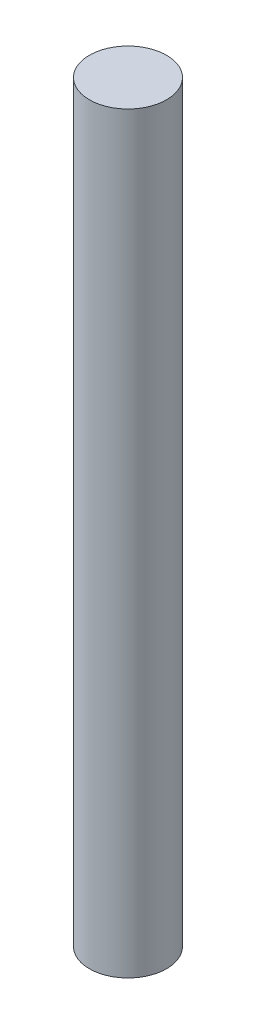
ISO-10303-21;
HEADER;
FILE_DESCRIPTION(('STEP AP214'),'2;1');
FILE_NAME('part.step','',(''),(''),'','','');
FILE_SCHEMA(('AUTOMOTIVE_DESIGN { 1 0 10303 214 1 1 1 1 }'));
ENDSEC;
DATA;
#1=APPLICATION_CONTEXT('core data for automotive mechanical design processes');
#2=APPLICATION_PROTOCOL_DEFINITION('international standard','automotive_design',2000,#1);
#3=PRODUCT_CONTEXT('',#1,'mechanical');
#4=PRODUCT('Part','Part','',(#3));
#5=PRODUCT_RELATED_PRODUCT_CATEGORY('part','',(#4));
#6=PRODUCT_DEFINITION_FORMATION('','',#4);
#7=PRODUCT_DEFINITION_CONTEXT('part definition',#1,'design');
#8=PRODUCT_DEFINITION('design','',#6,#7);
#9=PRODUCT_DEFINITION_SHAPE('','',#8);
#10=(LENGTH_UNIT() NAMED_UNIT(*) SI_UNIT(.MILLI.,.METRE.));
#11=(NAMED_UNIT(*) PLANE_ANGLE_UNIT() SI_UNIT($,.RADIAN.));
#12=(NAMED_UNIT(*) SI_UNIT($,.STERADIAN.) SOLID_ANGLE_UNIT());
#13=UNCERTAINTY_MEASURE_WITH_UNIT(LENGTH_MEASURE(1.E-05),#10,'distance_accuracy_value','');
#14=(GEOMETRIC_REPRESENTATION_CONTEXT(3) GLOBAL_UNCERTAINTY_ASSIGNED_CONTEXT((#13)) GLOBAL_UNIT_ASSIGNED_CONTEXT((#10,
#11,#12)) REPRESENTATION_CONTEXT('',''));
#15=CARTESIAN_POINT('',(0.,0.,0.));
#16=DIRECTION('',(0.,0.,1.));
#17=DIRECTION('',(1.,0.,0.));
#18=AXIS2_PLACEMENT_3D('',#15,#16,#17);
#19=CARTESIAN_POINT('',(0.,39.,0.));
#20=DIRECTION('',(0.,-1.,0.));
#21=DIRECTION('',(0.,0.,-1.));
#22=AXIS2_PLACEMENT_3D('',#19,#20,#21);
#23=CYLINDRICAL_SURFACE('',#22,2.);
#24=CARTESIAN_POINT('',(0.,39.,0.));
#25=DIRECTION('',(0.,1.,0.));
#26=DIRECTION('',(0.,0.,1.));
#27=AXIS2_PLACEMENT_3D('',#24,#25,#26);
#28=CIRCLE('',#27,2.);
#29=CARTESIAN_POINT('',(0.,39.,2.));
#30=VERTEX_POINT('',#29);
#31=EDGE_CURVE('E10',#30,#30,#28,.T.);
#32=ORIENTED_EDGE('',*,*,#31,.F.);
#33=EDGE_LOOP('',(#32));
#34=FACE_BOUND('',#33,.T.);
#35=CARTESIAN_POINT('',(0.,0.,0.));
#36=DIRECTION('',(0.,1.,0.));
#37=DIRECTION('',(0.,0.,1.));
#38=AXIS2_PLACEMENT_3D('',#35,#36,#37);
#39=CIRCLE('',#38,2.);
#40=CARTESIAN_POINT('',(0.,0.,2.));
#41=VERTEX_POINT('',#40);
#42=EDGE_CURVE('E34',#41,#41,#39,.T.);
#43=ORIENTED_EDGE('',*,*,#42,.T.);
#44=EDGE_LOOP('',(#43));
#45=FACE_BOUND('',#44,.T.);
#46=ADVANCED_FACE('F31',(#34,#45),#23,.T.);
#47=CARTESIAN_POINT('',(0.,39.,0.));
#48=DIRECTION('',(0.,1.,0.));
#49=DIRECTION('',(0.,0.,1.));
#50=AXIS2_PLACEMENT_3D('',#47,#48,#49);
#51=PLANE('',#50);
#52=ORIENTED_EDGE('',*,*,#31,.T.);
#53=EDGE_LOOP('',(#52));
#54=FACE_BOUND('',#53,.T.);
#55=ADVANCED_FACE('F46',(#54),#51,.T.);
#56=CARTESIAN_POINT('',(0.,0.,0.));
#57=DIRECTION('',(0.,1.,0.));
#58=DIRECTION('',(0.,0.,1.));
#59=AXIS2_PLACEMENT_3D('',#56,#57,#58);
#60=PLANE('',#59);
#61=ORIENTED_EDGE('',*,*,#42,.F.);
#62=EDGE_LOOP('',(#61));
#63=FACE_BOUND('',#62,.T.);
#64=ADVANCED_FACE('F44',(#63),#60,.F.);
#65=CLOSED_SHELL('',(#46,#55,#64));
#66=MANIFOLD_SOLID_BREP('B2',#65);
#67=ADVANCED_BREP_SHAPE_REPRESENTATION('',(#18,#66),#14);
#68=SHAPE_DEFINITION_REPRESENTATION(#9,#67);
ENDSEC;
END-ISO-10303-21;
